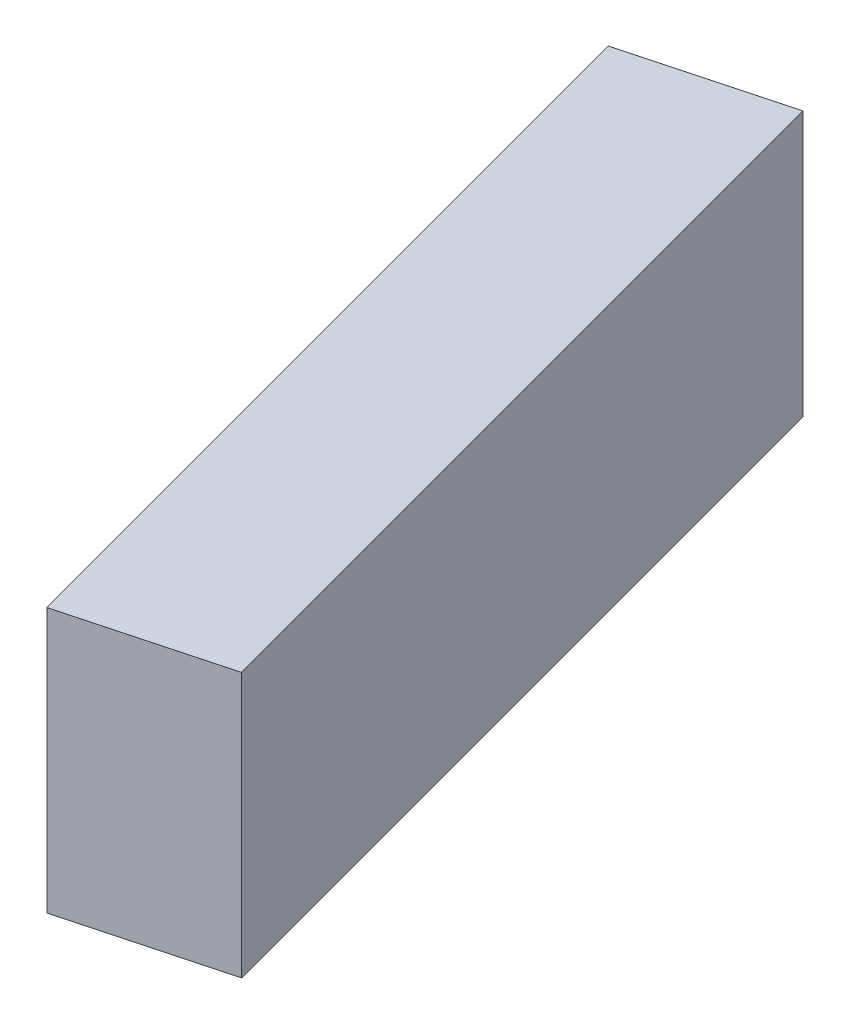
ISO-10303-21;
HEADER;
FILE_DESCRIPTION(('STEP AP214'),'2;1');
FILE_NAME('part.step','',(''),(''),'','','');
FILE_SCHEMA(('AUTOMOTIVE_DESIGN { 1 0 10303 214 1 1 1 1 }'));
ENDSEC;
DATA;
#1=APPLICATION_CONTEXT('core data for automotive mechanical design processes');
#2=APPLICATION_PROTOCOL_DEFINITION('international standard','automotive_design',2000,#1);
#3=PRODUCT_CONTEXT('',#1,'mechanical');
#4=PRODUCT('Part','Part','',(#3));
#5=PRODUCT_RELATED_PRODUCT_CATEGORY('part','',(#4));
#6=PRODUCT_DEFINITION_FORMATION('','',#4);
#7=PRODUCT_DEFINITION_CONTEXT('part definition',#1,'design');
#8=PRODUCT_DEFINITION('design','',#6,#7);
#9=PRODUCT_DEFINITION_SHAPE('','',#8);
#10=(LENGTH_UNIT() NAMED_UNIT(*) SI_UNIT(.MILLI.,.METRE.));
#11=(NAMED_UNIT(*) PLANE_ANGLE_UNIT() SI_UNIT($,.RADIAN.));
#12=(NAMED_UNIT(*) SI_UNIT($,.STERADIAN.) SOLID_ANGLE_UNIT());
#13=UNCERTAINTY_MEASURE_WITH_UNIT(LENGTH_MEASURE(1.E-05),#10,'distance_accuracy_value','');
#14=(GEOMETRIC_REPRESENTATION_CONTEXT(3) GLOBAL_UNCERTAINTY_ASSIGNED_CONTEXT((#13)) GLOBAL_UNIT_ASSIGNED_CONTEXT((#10,
#11,#12)) REPRESENTATION_CONTEXT('',''));
#15=CARTESIAN_POINT('',(0.,0.,0.));
#16=DIRECTION('',(0.,0.,1.));
#17=DIRECTION('',(1.,0.,0.));
#18=AXIS2_PLACEMENT_3D('',#15,#16,#17);
#19=CARTESIAN_POINT('',(933.93811271612,-550.,2303.540379835));
#20=DIRECTION('',(0.258819045102985,0.,0.965925826288944));
#21=DIRECTION('',(0.,-1.,0.));
#22=AXIS2_PLACEMENT_3D('',#19,#20,#21);
#23=PLANE('',#22);
#24=DIRECTION('',(-0.965925826288944,0.,0.258819045102985));
#25=VECTOR('',#24,1.);
#26=CARTESIAN_POINT('',(933.93811271612,-550.,2303.540379835));
#27=LINE('',#26,#25);
#28=CARTESIAN_POINT('',(933.93811271612,-550.,2303.540379835));
#29=VERTEX_POINT('',#28);
#30=CARTESIAN_POINT('',(928.14255775838,-550.,2305.093294105));
#31=VERTEX_POINT('',#30);
#32=EDGE_CURVE('E88',#29,#31,#27,.T.);
#33=ORIENTED_EDGE('',*,*,#32,.F.);
#34=DIRECTION('',(0.,1.,0.));
#35=VECTOR('',#34,1.);
#36=CARTESIAN_POINT('',(933.93811271612,-550.,2303.540379835));
#37=LINE('',#36,#35);
#38=CARTESIAN_POINT('',(933.93811271612,-540.,2303.540379835));
#39=VERTEX_POINT('',#38);
#40=EDGE_CURVE('E70',#29,#39,#37,.T.);
#41=ORIENTED_EDGE('',*,*,#40,.T.);
#42=DIRECTION('',(-0.965925826288944,0.,0.258819045102985));
#43=VECTOR('',#42,1.);
#44=CARTESIAN_POINT('',(933.93811271612,-540.,2303.540379835));
#45=LINE('',#44,#43);
#46=CARTESIAN_POINT('',(928.14255775838,-540.,2305.093294105));
#47=VERTEX_POINT('',#46);
#48=EDGE_CURVE('E82',#39,#47,#45,.T.);
#49=ORIENTED_EDGE('',*,*,#48,.T.);
#50=DIRECTION('',(0.,1.,0.));
#51=VECTOR('',#50,1.);
#52=CARTESIAN_POINT('',(928.14255775838,-550.,2305.093294105));
#53=LINE('',#52,#51);
#54=EDGE_CURVE('E11',#31,#47,#53,.T.);
#55=ORIENTED_EDGE('',*,*,#54,.F.);
#56=EDGE_LOOP('',(#33,#41,#49,#55));
#57=FACE_BOUND('',#56,.T.);
#58=ADVANCED_FACE('F17',(#57),#23,.T.);
#59=CARTESIAN_POINT('',(926.17354136304,-550.,2274.562605046));
#60=DIRECTION('',(0.258819045102985,0.,0.965925826288944));
#61=DIRECTION('',(0.,-1.,0.));
#62=AXIS2_PLACEMENT_3D('',#59,#60,#61);
#63=PLANE('',#62);
#64=DIRECTION('',(0.,1.,0.));
#65=VECTOR('',#64,1.);
#66=CARTESIAN_POINT('',(920.37798640531,-550.,2276.115519317));
#67=LINE('',#66,#65);
#68=CARTESIAN_POINT('',(920.37798640531,-550.,2276.115519317));
#69=VERTEX_POINT('',#68);
#70=CARTESIAN_POINT('',(920.37798640531,-540.,2276.115519317));
#71=VERTEX_POINT('',#70);
#72=EDGE_CURVE('E25',#69,#71,#67,.T.);
#73=ORIENTED_EDGE('',*,*,#72,.T.);
#74=DIRECTION('',(-0.965925826288944,0.,0.258819045102985));
#75=VECTOR('',#74,1.);
#76=CARTESIAN_POINT('',(926.17354136304,-540.,2274.562605046));
#77=LINE('',#76,#75);
#78=CARTESIAN_POINT('',(926.17354136304,-540.,2274.562605046));
#79=VERTEX_POINT('',#78);
#80=EDGE_CURVE('E103',#79,#71,#77,.T.);
#81=ORIENTED_EDGE('',*,*,#80,.F.);
#82=DIRECTION('',(0.,1.,0.));
#83=VECTOR('',#82,1.);
#84=CARTESIAN_POINT('',(926.17354136304,-550.,2274.562605046));
#85=LINE('',#84,#83);
#86=CARTESIAN_POINT('',(926.17354136304,-550.,2274.562605046));
#87=VERTEX_POINT('',#86);
#88=EDGE_CURVE('E81',#87,#79,#85,.T.);
#89=ORIENTED_EDGE('',*,*,#88,.F.);
#90=DIRECTION('',(-0.965925826288944,0.,0.258819045102985));
#91=VECTOR('',#90,1.);
#92=CARTESIAN_POINT('',(926.17354136304,-550.,2274.562605046));
#93=LINE('',#92,#91);
#94=EDGE_CURVE('E89',#87,#69,#93,.T.);
#95=ORIENTED_EDGE('',*,*,#94,.T.);
#96=EDGE_LOOP('',(#73,#81,#89,#95));
#97=FACE_BOUND('',#96,.T.);
#98=ADVANCED_FACE('F147',(#97),#63,.F.);
#99=CARTESIAN_POINT('',(920.37798640531,-550.,2276.115519317));
#100=DIRECTION('',(-0.965925826288944,0.,0.258819045102985));
#101=DIRECTION('',(0.,1.,0.));
#102=AXIS2_PLACEMENT_3D('',#99,#100,#101);
#103=PLANE('',#102);
#104=ORIENTED_EDGE('',*,*,#72,.F.);
#105=DIRECTION('',(0.258819045102985,0.,0.965925826288944));
#106=VECTOR('',#105,1.);
#107=CARTESIAN_POINT('',(920.37798640531,-550.,2276.115519317));
#108=LINE('',#107,#106);
#109=EDGE_CURVE('E93',#69,#31,#108,.T.);
#110=ORIENTED_EDGE('',*,*,#109,.T.);
#111=ORIENTED_EDGE('',*,*,#54,.T.);
#112=DIRECTION('',(0.258819045102985,0.,0.965925826288944));
#113=VECTOR('',#112,1.);
#114=CARTESIAN_POINT('',(920.37798640531,-540.,2276.115519317));
#115=LINE('',#114,#113);
#116=EDGE_CURVE('E107',#71,#47,#115,.T.);
#117=ORIENTED_EDGE('',*,*,#116,.F.);
#118=EDGE_LOOP('',(#104,#110,#111,#117));
#119=FACE_BOUND('',#118,.T.);
#120=ADVANCED_FACE('F140',(#119),#103,.T.);
#121=CARTESIAN_POINT('',(926.17354136304,-550.,2274.562605046));
#122=DIRECTION('',(-0.965925826288944,0.,0.258819045102985));
#123=DIRECTION('',(0.,1.,0.));
#124=AXIS2_PLACEMENT_3D('',#121,#122,#123);
#125=PLANE('',#124);
#126=DIRECTION('',(0.258819045102985,0.,0.965925826288944));
#127=VECTOR('',#126,1.);
#128=CARTESIAN_POINT('',(926.17354136304,-540.,2274.562605046));
#129=LINE('',#128,#127);
#130=EDGE_CURVE('E76',#79,#39,#129,.T.);
#131=ORIENTED_EDGE('',*,*,#130,.T.);
#132=ORIENTED_EDGE('',*,*,#40,.F.);
#133=DIRECTION('',(0.258819045102985,0.,0.965925826288944));
#134=VECTOR('',#133,1.);
#135=CARTESIAN_POINT('',(926.17354136304,-550.,2274.562605046));
#136=LINE('',#135,#134);
#137=EDGE_CURVE('E73',#87,#29,#136,.T.);
#138=ORIENTED_EDGE('',*,*,#137,.F.);
#139=ORIENTED_EDGE('',*,*,#88,.T.);
#140=EDGE_LOOP('',(#131,#132,#138,#139));
#141=FACE_BOUND('',#140,.T.);
#142=ADVANCED_FACE('F72',(#141),#125,.F.);
#143=CARTESIAN_POINT('',(926.17354136304,-540.,2274.562605046));
#144=DIRECTION('',(0.,1.,0.));
#145=DIRECTION('',(1.,0.,0.));
#146=AXIS2_PLACEMENT_3D('',#143,#144,#145);
#147=PLANE('',#146);
#148=ORIENTED_EDGE('',*,*,#130,.F.);
#149=ORIENTED_EDGE('',*,*,#80,.T.);
#150=ORIENTED_EDGE('',*,*,#116,.T.);
#151=ORIENTED_EDGE('',*,*,#48,.F.);
#152=EDGE_LOOP('',(#148,#149,#150,#151));
#153=FACE_BOUND('',#152,.T.);
#154=ADVANCED_FACE('F125',(#153),#147,.T.);
#155=CARTESIAN_POINT('',(926.17354136304,-550.,2274.562605046));
#156=DIRECTION('',(0.,1.,0.));
#157=DIRECTION('',(1.,0.,0.));
#158=AXIS2_PLACEMENT_3D('',#155,#156,#157);
#159=PLANE('',#158);
#160=ORIENTED_EDGE('',*,*,#32,.T.);
#161=ORIENTED_EDGE('',*,*,#109,.F.);
#162=ORIENTED_EDGE('',*,*,#94,.F.);
#163=ORIENTED_EDGE('',*,*,#137,.T.);
#164=EDGE_LOOP('',(#160,#161,#162,#163));
#165=FACE_BOUND('',#164,.T.);
#166=ADVANCED_FACE('F86',(#165),#159,.F.);
#167=CLOSED_SHELL('',(#58,#98,#120,#142,#154,#166));
#168=MANIFOLD_SOLID_BREP('B1',#167);
#169=ADVANCED_BREP_SHAPE_REPRESENTATION('',(#18,#168),#14);
#170=SHAPE_DEFINITION_REPRESENTATION(#9,#169);
ENDSEC;
END-ISO-10303-21;
